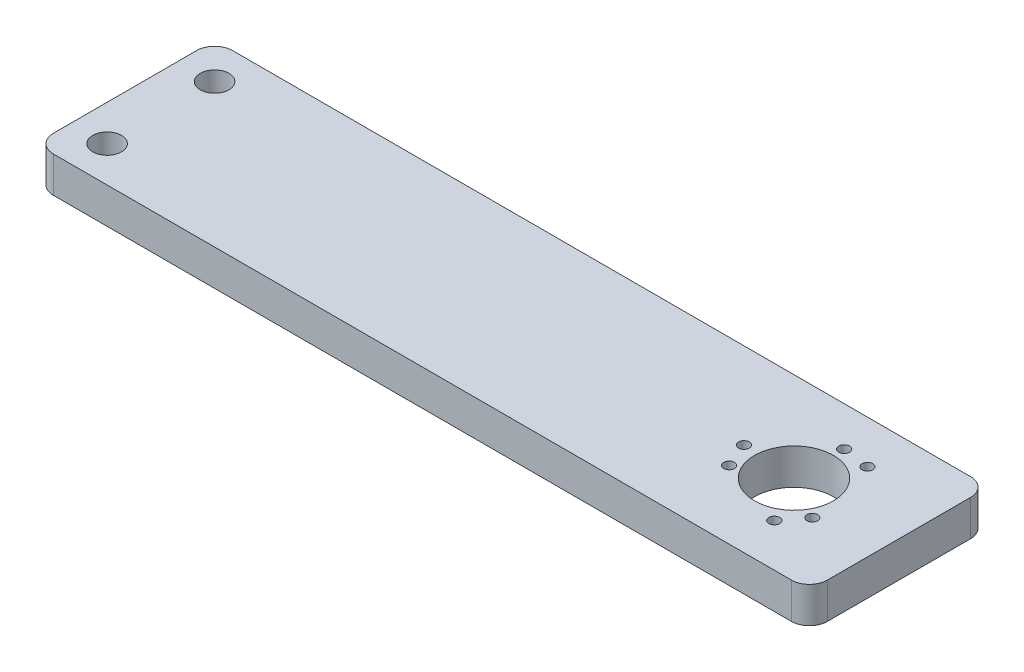
ISO-10303-21;
HEADER;
FILE_DESCRIPTION(('STEP AP214'),'2;1');
FILE_NAME('part.step','',(''),(''),'','','');
FILE_SCHEMA(('AUTOMOTIVE_DESIGN { 1 0 10303 214 1 1 1 1 }'));
ENDSEC;
DATA;
#1=APPLICATION_CONTEXT('core data for automotive mechanical design processes');
#2=APPLICATION_PROTOCOL_DEFINITION('international standard','automotive_design',2000,#1);
#3=PRODUCT_CONTEXT('',#1,'mechanical');
#4=PRODUCT('Part','Part','',(#3));
#5=PRODUCT_RELATED_PRODUCT_CATEGORY('part','',(#4));
#6=PRODUCT_DEFINITION_FORMATION('','',#4);
#7=PRODUCT_DEFINITION_CONTEXT('part definition',#1,'design');
#8=PRODUCT_DEFINITION('design','',#6,#7);
#9=PRODUCT_DEFINITION_SHAPE('','',#8);
#10=(LENGTH_UNIT() NAMED_UNIT(*) SI_UNIT(.MILLI.,.METRE.));
#11=(NAMED_UNIT(*) PLANE_ANGLE_UNIT() SI_UNIT($,.RADIAN.));
#12=(NAMED_UNIT(*) SI_UNIT($,.STERADIAN.) SOLID_ANGLE_UNIT());
#13=UNCERTAINTY_MEASURE_WITH_UNIT(LENGTH_MEASURE(1.E-05),#10,'distance_accuracy_value','');
#14=(GEOMETRIC_REPRESENTATION_CONTEXT(3) GLOBAL_UNCERTAINTY_ASSIGNED_CONTEXT((#13)) GLOBAL_UNIT_ASSIGNED_CONTEXT((#10,
#11,#12)) REPRESENTATION_CONTEXT('',''));
#15=CARTESIAN_POINT('',(0.,0.,0.));
#16=DIRECTION('',(0.,0.,1.));
#17=DIRECTION('',(1.,0.,0.));
#18=AXIS2_PLACEMENT_3D('',#15,#16,#17);
#19=CARTESIAN_POINT('',(-103.,10.,-20.));
#20=DIRECTION('',(0.,-1.,0.));
#21=DIRECTION('',(0.,0.,-1.));
#22=AXIS2_PLACEMENT_3D('',#19,#20,#21);
#23=PLANE('',#22);
#24=CARTESIAN_POINT('',(-103.,10.,-20.));
#25=DIRECTION('',(0.,-1.,0.));
#26=DIRECTION('',(0.,0.,-1.));
#27=AXIS2_PLACEMENT_3D('',#24,#25,#26);
#28=CIRCLE('',#27,5.);
#29=CARTESIAN_POINT('',(-108.,10.,-20.));
#30=VERTEX_POINT('',#29);
#31=CARTESIAN_POINT('',(-103.,10.,-25.));
#32=VERTEX_POINT('',#31);
#33=EDGE_CURVE('E411',#30,#32,#28,.T.);
#34=ORIENTED_EDGE('',*,*,#33,.F.);
#35=DIRECTION('',(0.,0.,-1.));
#36=VECTOR('',#35,1.);
#37=CARTESIAN_POINT('',(-108.,10.,20.));
#38=LINE('',#37,#36);
#39=CARTESIAN_POINT('',(-108.,10.,20.));
#40=VERTEX_POINT('',#39);
#41=EDGE_CURVE('E386',#40,#30,#38,.T.);
#42=ORIENTED_EDGE('',*,*,#41,.F.);
#43=CARTESIAN_POINT('',(-103.,10.,20.));
#44=DIRECTION('',(0.,-1.,0.));
#45=DIRECTION('',(0.,0.,-1.));
#46=AXIS2_PLACEMENT_3D('',#43,#44,#45);
#47=CIRCLE('',#46,5.);
#48=CARTESIAN_POINT('',(-103.,10.,25.));
#49=VERTEX_POINT('',#48);
#50=EDGE_CURVE('E370',#49,#40,#47,.T.);
#51=ORIENTED_EDGE('',*,*,#50,.F.);
#52=DIRECTION('',(1.,0.,0.));
#53=VECTOR('',#52,1.);
#54=CARTESIAN_POINT('',(-103.,10.,25.));
#55=LINE('',#54,#53);
#56=CARTESIAN_POINT('',(103.,10.,25.));
#57=VERTEX_POINT('',#56);
#58=EDGE_CURVE('E378',#49,#57,#55,.T.);
#59=ORIENTED_EDGE('',*,*,#58,.T.);
#60=CARTESIAN_POINT('',(103.,10.,20.));
#61=DIRECTION('',(0.,1.,0.));
#62=DIRECTION('',(0.,0.,1.));
#63=AXIS2_PLACEMENT_3D('',#60,#61,#62);
#64=CIRCLE('',#63,5.);
#65=CARTESIAN_POINT('',(108.,10.,20.));
#66=VERTEX_POINT('',#65);
#67=EDGE_CURVE('E383',#57,#66,#64,.T.);
#68=ORIENTED_EDGE('',*,*,#67,.T.);
#69=DIRECTION('',(0.,0.,-1.));
#70=VECTOR('',#69,1.);
#71=CARTESIAN_POINT('',(108.,10.,20.));
#72=LINE('',#71,#70);
#73=CARTESIAN_POINT('',(108.,10.,-20.));
#74=VERTEX_POINT('',#73);
#75=EDGE_CURVE('E542',#66,#74,#72,.T.);
#76=ORIENTED_EDGE('',*,*,#75,.T.);
#77=CARTESIAN_POINT('',(103.,10.,-20.));
#78=DIRECTION('',(0.,-1.,0.));
#79=DIRECTION('',(0.,0.,-1.));
#80=AXIS2_PLACEMENT_3D('',#77,#78,#79);
#81=CIRCLE('',#80,5.);
#82=CARTESIAN_POINT('',(103.,10.,-25.));
#83=VERTEX_POINT('',#82);
#84=EDGE_CURVE('E539',#83,#74,#81,.T.);
#85=ORIENTED_EDGE('',*,*,#84,.F.);
#86=DIRECTION('',(1.,0.,0.));
#87=VECTOR('',#86,1.);
#88=CARTESIAN_POINT('',(-103.,10.,-25.));
#89=LINE('',#88,#87);
#90=EDGE_CURVE('E537',#32,#83,#89,.T.);
#91=ORIENTED_EDGE('',*,*,#90,.F.);
#92=EDGE_LOOP('',(#34,#42,#51,#59,#68,#76,#85,#91));
#93=FACE_BOUND('',#92,.T.);
#94=CARTESIAN_POINT('',(-98.,10.,-15.));
#95=DIRECTION('',(0.,1.,0.));
#96=DIRECTION('',(0.,0.,1.));
#97=AXIS2_PLACEMENT_3D('',#94,#95,#96);
#98=CIRCLE('',#97,4.00000000000001);
#99=CARTESIAN_POINT('',(-98.,10.,-11.));
#100=VERTEX_POINT('',#99);
#101=EDGE_CURVE('E395',#100,#100,#98,.T.);
#102=ORIENTED_EDGE('',*,*,#101,.F.);
#103=EDGE_LOOP('',(#102));
#104=FACE_BOUND('',#103,.T.);
#105=CARTESIAN_POINT('',(-98.,10.,15.));
#106=DIRECTION('',(0.,1.,0.));
#107=DIRECTION('',(0.,0.,1.));
#108=AXIS2_PLACEMENT_3D('',#105,#106,#107);
#109=CIRCLE('',#108,4.00000000000001);
#110=CARTESIAN_POINT('',(-98.,10.,19.));
#111=VERTEX_POINT('',#110);
#112=EDGE_CURVE('E526',#111,#111,#109,.T.);
#113=ORIENTED_EDGE('',*,*,#112,.F.);
#114=EDGE_LOOP('',(#113));
#115=FACE_BOUND('',#114,.T.);
#116=CARTESIAN_POINT('',(78.7,10.,0.));
#117=DIRECTION('',(0.,1.,0.));
#118=DIRECTION('',(0.,0.,1.));
#119=AXIS2_PLACEMENT_3D('',#116,#117,#118);
#120=CIRCLE('',#119,11.);
#121=CARTESIAN_POINT('',(78.7,10.,11.));
#122=VERTEX_POINT('',#121);
#123=EDGE_CURVE('E520',#122,#122,#120,.T.);
#124=ORIENTED_EDGE('',*,*,#123,.F.);
#125=EDGE_LOOP('',(#124));
#126=FACE_BOUND('',#125,.T.);
#127=CARTESIAN_POINT('',(66.57564435,10.,5.99106836347522));
#128=DIRECTION('',(0.,1.,0.));
#129=DIRECTION('',(0.,0.,1.));
#130=AXIS2_PLACEMENT_3D('',#127,#128,#129);
#131=CIRCLE('',#130,1.5);
#132=CARTESIAN_POINT('',(66.57564435,10.,7.49106836347522));
#133=VERTEX_POINT('',#132);
#134=EDGE_CURVE('E514',#133,#133,#131,.T.);
#135=ORIENTED_EDGE('',*,*,#134,.F.);
#136=EDGE_LOOP('',(#135));
#137=FACE_BOUND('',#136,.T.);
#138=CARTESIAN_POINT('',(63.7,10.,-1.00893163652478));
#139=DIRECTION('',(0.,1.,0.));
#140=DIRECTION('',(0.,0.,1.));
#141=AXIS2_PLACEMENT_3D('',#138,#139,#140);
#142=CIRCLE('',#141,1.5);
#143=CARTESIAN_POINT('',(63.7,10.,0.491068363475221));
#144=VERTEX_POINT('',#143);
#145=EDGE_CURVE('E508',#144,#144,#142,.T.);
#146=ORIENTED_EDGE('',*,*,#145,.F.);
#147=EDGE_LOOP('',(#146));
#148=FACE_BOUND('',#147,.T.);
#149=CARTESIAN_POINT('',(78.7,10.,-14.));
#150=DIRECTION('',(0.,1.,0.));
#151=DIRECTION('',(0.,0.,1.));
#152=AXIS2_PLACEMENT_3D('',#149,#150,#151);
#153=CIRCLE('',#152,1.5);
#154=CARTESIAN_POINT('',(78.7,10.,-12.5));
#155=VERTEX_POINT('',#154);
#156=EDGE_CURVE('E502',#155,#155,#153,.T.);
#157=ORIENTED_EDGE('',*,*,#156,.F.);
#158=EDGE_LOOP('',(#157));
#159=FACE_BOUND('',#158,.T.);
#160=CARTESIAN_POINT('',(86.2,10.,-12.99038106));
#161=DIRECTION('',(0.,1.,0.));
#162=DIRECTION('',(0.,0.,1.));
#163=AXIS2_PLACEMENT_3D('',#160,#161,#162);
#164=CIRCLE('',#163,1.49999999999998);
#165=CARTESIAN_POINT('',(86.2,10.,-11.49038106));
#166=VERTEX_POINT('',#165);
#167=EDGE_CURVE('E496',#166,#166,#164,.T.);
#168=ORIENTED_EDGE('',*,*,#167,.F.);
#169=EDGE_LOOP('',(#168));
#170=FACE_BOUND('',#169,.T.);
#171=CARTESIAN_POINT('',(90.82435565,10.,7.00000000172179));
#172=DIRECTION('',(0.,1.,0.));
#173=DIRECTION('',(0.,0.,1.));
#174=AXIS2_PLACEMENT_3D('',#171,#172,#173);
#175=CIRCLE('',#174,1.5);
#176=CARTESIAN_POINT('',(90.82435565,10.,8.50000000172179));
#177=VERTEX_POINT('',#176);
#178=EDGE_CURVE('E490',#177,#177,#175,.T.);
#179=ORIENTED_EDGE('',*,*,#178,.F.);
#180=EDGE_LOOP('',(#179));
#181=FACE_BOUND('',#180,.T.);
#182=CARTESIAN_POINT('',(86.1999999970179,10.,12.9903810584883));
#183=DIRECTION('',(0.,1.,0.));
#184=DIRECTION('',(0.,0.,1.));
#185=AXIS2_PLACEMENT_3D('',#182,#183,#184);
#186=CIRCLE('',#185,1.5);
#187=CARTESIAN_POINT('',(86.1999999970179,10.,14.4903810584883));
#188=VERTEX_POINT('',#187);
#189=EDGE_CURVE('E481',#188,#188,#186,.T.);
#190=ORIENTED_EDGE('',*,*,#189,.F.);
#191=EDGE_LOOP('',(#190));
#192=FACE_BOUND('',#191,.T.);
#193=ADVANCED_FACE('F296',(#93,#104,#115,#126,#137,#148,#159,#170,#181,#192),#23,.F.);
#194=CARTESIAN_POINT('',(-103.,0.,-20.));
#195=DIRECTION('',(0.,-1.,0.));
#196=DIRECTION('',(0.,0.,-1.));
#197=AXIS2_PLACEMENT_3D('',#194,#195,#196);
#198=PLANE('',#197);
#199=CARTESIAN_POINT('',(90.82435565,0.,7.00000000172179));
#200=DIRECTION('',(0.,1.,0.));
#201=DIRECTION('',(0.,0.,1.));
#202=AXIS2_PLACEMENT_3D('',#199,#200,#201);
#203=CIRCLE('',#202,1.5);
#204=CARTESIAN_POINT('',(90.82435565,0.,8.50000000172179));
#205=VERTEX_POINT('',#204);
#206=EDGE_CURVE('E487',#205,#205,#203,.T.);
#207=ORIENTED_EDGE('',*,*,#206,.T.);
#208=EDGE_LOOP('',(#207));
#209=FACE_BOUND('',#208,.T.);
#210=CARTESIAN_POINT('',(78.7,0.,-14.));
#211=DIRECTION('',(0.,1.,0.));
#212=DIRECTION('',(0.,0.,1.));
#213=AXIS2_PLACEMENT_3D('',#210,#211,#212);
#214=CIRCLE('',#213,1.5);
#215=CARTESIAN_POINT('',(78.7,0.,-12.5));
#216=VERTEX_POINT('',#215);
#217=EDGE_CURVE('E499',#216,#216,#214,.T.);
#218=ORIENTED_EDGE('',*,*,#217,.T.);
#219=EDGE_LOOP('',(#218));
#220=FACE_BOUND('',#219,.T.);
#221=CARTESIAN_POINT('',(66.57564435,0.,5.99106836347522));
#222=DIRECTION('',(0.,1.,0.));
#223=DIRECTION('',(0.,0.,1.));
#224=AXIS2_PLACEMENT_3D('',#221,#222,#223);
#225=CIRCLE('',#224,1.5);
#226=CARTESIAN_POINT('',(66.57564435,0.,7.49106836347522));
#227=VERTEX_POINT('',#226);
#228=EDGE_CURVE('E511',#227,#227,#225,.T.);
#229=ORIENTED_EDGE('',*,*,#228,.T.);
#230=EDGE_LOOP('',(#229));
#231=FACE_BOUND('',#230,.T.);
#232=CARTESIAN_POINT('',(-98.,0.,15.));
#233=DIRECTION('',(0.,1.,0.));
#234=DIRECTION('',(0.,0.,1.));
#235=AXIS2_PLACEMENT_3D('',#232,#233,#234);
#236=CIRCLE('',#235,4.00000000000001);
#237=CARTESIAN_POINT('',(-98.,0.,19.));
#238=VERTEX_POINT('',#237);
#239=EDGE_CURVE('E523',#238,#238,#236,.T.);
#240=ORIENTED_EDGE('',*,*,#239,.T.);
#241=EDGE_LOOP('',(#240));
#242=FACE_BOUND('',#241,.T.);
#243=CARTESIAN_POINT('',(-103.,0.,-20.));
#244=DIRECTION('',(0.,-1.,0.));
#245=DIRECTION('',(0.,0.,-1.));
#246=AXIS2_PLACEMENT_3D('',#243,#244,#245);
#247=CIRCLE('',#246,5.);
#248=CARTESIAN_POINT('',(-108.,0.,-20.));
#249=VERTEX_POINT('',#248);
#250=CARTESIAN_POINT('',(-103.,0.,-25.));
#251=VERTEX_POINT('',#250);
#252=EDGE_CURVE('E391',#249,#251,#247,.T.);
#253=ORIENTED_EDGE('',*,*,#252,.T.);
#254=DIRECTION('',(1.,0.,0.));
#255=VECTOR('',#254,1.);
#256=CARTESIAN_POINT('',(-103.,0.,-25.));
#257=LINE('',#256,#255);
#258=CARTESIAN_POINT('',(103.,0.,-25.));
#259=VERTEX_POINT('',#258);
#260=EDGE_CURVE('E394',#251,#259,#257,.T.);
#261=ORIENTED_EDGE('',*,*,#260,.T.);
#262=CARTESIAN_POINT('',(103.,0.,-20.));
#263=DIRECTION('',(0.,-1.,0.));
#264=DIRECTION('',(0.,0.,-1.));
#265=AXIS2_PLACEMENT_3D('',#262,#263,#264);
#266=CIRCLE('',#265,5.);
#267=CARTESIAN_POINT('',(108.,0.,-20.));
#268=VERTEX_POINT('',#267);
#269=EDGE_CURVE('E398',#259,#268,#266,.T.);
#270=ORIENTED_EDGE('',*,*,#269,.T.);
#271=DIRECTION('',(0.,0.,-1.));
#272=VECTOR('',#271,1.);
#273=CARTESIAN_POINT('',(108.,0.,20.));
#274=LINE('',#273,#272);
#275=CARTESIAN_POINT('',(108.,0.,20.));
#276=VERTEX_POINT('',#275);
#277=EDGE_CURVE('E401',#276,#268,#274,.T.);
#278=ORIENTED_EDGE('',*,*,#277,.F.);
#279=CARTESIAN_POINT('',(103.,0.,20.));
#280=DIRECTION('',(0.,1.,0.));
#281=DIRECTION('',(0.,0.,1.));
#282=AXIS2_PLACEMENT_3D('',#279,#280,#281);
#283=CIRCLE('',#282,5.);
#284=CARTESIAN_POINT('',(103.,0.,25.));
#285=VERTEX_POINT('',#284);
#286=EDGE_CURVE('E404',#285,#276,#283,.T.);
#287=ORIENTED_EDGE('',*,*,#286,.F.);
#288=DIRECTION('',(1.,0.,0.));
#289=VECTOR('',#288,1.);
#290=CARTESIAN_POINT('',(-103.,0.,25.));
#291=LINE('',#290,#289);
#292=CARTESIAN_POINT('',(-103.,0.,25.));
#293=VERTEX_POINT('',#292);
#294=EDGE_CURVE('E406',#293,#285,#291,.T.);
#295=ORIENTED_EDGE('',*,*,#294,.F.);
#296=CARTESIAN_POINT('',(-103.,0.,20.));
#297=DIRECTION('',(0.,-1.,0.));
#298=DIRECTION('',(0.,0.,-1.));
#299=AXIS2_PLACEMENT_3D('',#296,#297,#298);
#300=CIRCLE('',#299,5.);
#301=CARTESIAN_POINT('',(-108.,0.,20.));
#302=VERTEX_POINT('',#301);
#303=EDGE_CURVE('E372',#293,#302,#300,.T.);
#304=ORIENTED_EDGE('',*,*,#303,.T.);
#305=DIRECTION('',(0.,0.,-1.));
#306=VECTOR('',#305,1.);
#307=CARTESIAN_POINT('',(-108.,0.,20.));
#308=LINE('',#307,#306);
#309=EDGE_CURVE('E409',#302,#249,#308,.T.);
#310=ORIENTED_EDGE('',*,*,#309,.T.);
#311=EDGE_LOOP('',(#253,#261,#270,#278,#287,#295,#304,#310));
#312=FACE_BOUND('',#311,.T.);
#313=CARTESIAN_POINT('',(-98.,0.,-15.));
#314=DIRECTION('',(0.,1.,0.));
#315=DIRECTION('',(0.,0.,1.));
#316=AXIS2_PLACEMENT_3D('',#313,#314,#315);
#317=CIRCLE('',#316,4.00000000000001);
#318=CARTESIAN_POINT('',(-98.,0.,-11.));
#319=VERTEX_POINT('',#318);
#320=EDGE_CURVE('E529',#319,#319,#317,.T.);
#321=ORIENTED_EDGE('',*,*,#320,.T.);
#322=EDGE_LOOP('',(#321));
#323=FACE_BOUND('',#322,.T.);
#324=CARTESIAN_POINT('',(78.7,0.,0.));
#325=DIRECTION('',(0.,1.,0.));
#326=DIRECTION('',(0.,0.,1.));
#327=AXIS2_PLACEMENT_3D('',#324,#325,#326);
#328=CIRCLE('',#327,11.);
#329=CARTESIAN_POINT('',(78.7,0.,11.));
#330=VERTEX_POINT('',#329);
#331=EDGE_CURVE('E517',#330,#330,#328,.T.);
#332=ORIENTED_EDGE('',*,*,#331,.T.);
#333=EDGE_LOOP('',(#332));
#334=FACE_BOUND('',#333,.T.);
#335=CARTESIAN_POINT('',(63.7,0.,-1.00893163652478));
#336=DIRECTION('',(0.,1.,0.));
#337=DIRECTION('',(0.,0.,1.));
#338=AXIS2_PLACEMENT_3D('',#335,#336,#337);
#339=CIRCLE('',#338,1.5);
#340=CARTESIAN_POINT('',(63.7,0.,0.491068363475221));
#341=VERTEX_POINT('',#340);
#342=EDGE_CURVE('E505',#341,#341,#339,.T.);
#343=ORIENTED_EDGE('',*,*,#342,.T.);
#344=EDGE_LOOP('',(#343));
#345=FACE_BOUND('',#344,.T.);
#346=CARTESIAN_POINT('',(86.2,0.,-12.99038106));
#347=DIRECTION('',(0.,1.,0.));
#348=DIRECTION('',(0.,0.,1.));
#349=AXIS2_PLACEMENT_3D('',#346,#347,#348);
#350=CIRCLE('',#349,1.49999999999998);
#351=CARTESIAN_POINT('',(86.2,0.,-11.49038106));
#352=VERTEX_POINT('',#351);
#353=EDGE_CURVE('E493',#352,#352,#350,.T.);
#354=ORIENTED_EDGE('',*,*,#353,.T.);
#355=EDGE_LOOP('',(#354));
#356=FACE_BOUND('',#355,.T.);
#357=CARTESIAN_POINT('',(86.1999999970179,0.,12.9903810584883));
#358=DIRECTION('',(0.,1.,0.));
#359=DIRECTION('',(0.,0.,1.));
#360=AXIS2_PLACEMENT_3D('',#357,#358,#359);
#361=CIRCLE('',#360,1.5);
#362=CARTESIAN_POINT('',(86.1999999970179,0.,14.4903810584883));
#363=VERTEX_POINT('',#362);
#364=EDGE_CURVE('E484',#363,#363,#361,.T.);
#365=ORIENTED_EDGE('',*,*,#364,.T.);
#366=EDGE_LOOP('',(#365));
#367=FACE_BOUND('',#366,.T.);
#368=ADVANCED_FACE('F423',(#209,#220,#231,#242,#312,#323,#334,#345,#356,#367),#198,.T.);
#369=CARTESIAN_POINT('',(-103.,10.,-20.));
#370=DIRECTION('',(0.,-1.,0.));
#371=DIRECTION('',(0.,0.,-1.));
#372=AXIS2_PLACEMENT_3D('',#369,#370,#371);
#373=CYLINDRICAL_SURFACE('',#372,5.);
#374=ORIENTED_EDGE('',*,*,#252,.F.);
#375=DIRECTION('',(0.,-1.,0.));
#376=VECTOR('',#375,1.);
#377=CARTESIAN_POINT('',(-108.,10.,-20.));
#378=LINE('',#377,#376);
#379=EDGE_CURVE('E12',#30,#249,#378,.T.);
#380=ORIENTED_EDGE('',*,*,#379,.F.);
#381=ORIENTED_EDGE('',*,*,#33,.T.);
#382=DIRECTION('',(0.,-1.,0.));
#383=VECTOR('',#382,1.);
#384=CARTESIAN_POINT('',(-103.,10.,-25.));
#385=LINE('',#384,#383);
#386=EDGE_CURVE('E300',#32,#251,#385,.T.);
#387=ORIENTED_EDGE('',*,*,#386,.T.);
#388=EDGE_LOOP('',(#374,#380,#381,#387));
#389=FACE_BOUND('',#388,.T.);
#390=ADVANCED_FACE('F298',(#389),#373,.T.);
#391=CARTESIAN_POINT('',(-108.,10.,20.));
#392=DIRECTION('',(-1.,0.,0.));
#393=DIRECTION('',(0.,0.,1.));
#394=AXIS2_PLACEMENT_3D('',#391,#392,#393);
#395=PLANE('',#394);
#396=ORIENTED_EDGE('',*,*,#309,.F.);
#397=DIRECTION('',(0.,-1.,0.));
#398=VECTOR('',#397,1.);
#399=CARTESIAN_POINT('',(-108.,10.,20.));
#400=LINE('',#399,#398);
#401=EDGE_CURVE('E306',#40,#302,#400,.T.);
#402=ORIENTED_EDGE('',*,*,#401,.F.);
#403=ORIENTED_EDGE('',*,*,#41,.T.);
#404=ORIENTED_EDGE('',*,*,#379,.T.);
#405=EDGE_LOOP('',(#396,#402,#403,#404));
#406=FACE_BOUND('',#405,.T.);
#407=ADVANCED_FACE('F425',(#406),#395,.T.);
#408=CARTESIAN_POINT('',(-103.,10.,20.));
#409=DIRECTION('',(0.,-1.,0.));
#410=DIRECTION('',(0.,0.,-1.));
#411=AXIS2_PLACEMENT_3D('',#408,#409,#410);
#412=CYLINDRICAL_SURFACE('',#411,5.);
#413=ORIENTED_EDGE('',*,*,#303,.F.);
#414=DIRECTION('',(0.,-1.,0.));
#415=VECTOR('',#414,1.);
#416=CARTESIAN_POINT('',(-103.,10.,25.));
#417=LINE('',#416,#415);
#418=EDGE_CURVE('E366',#49,#293,#417,.T.);
#419=ORIENTED_EDGE('',*,*,#418,.F.);
#420=ORIENTED_EDGE('',*,*,#50,.T.);
#421=ORIENTED_EDGE('',*,*,#401,.T.);
#422=EDGE_LOOP('',(#413,#419,#420,#421));
#423=FACE_BOUND('',#422,.T.);
#424=ADVANCED_FACE('F368',(#423),#412,.T.);
#425=CARTESIAN_POINT('',(-103.,10.,25.));
#426=DIRECTION('',(0.,0.,-1.));
#427=DIRECTION('',(-1.,0.,0.));
#428=AXIS2_PLACEMENT_3D('',#425,#426,#427);
#429=PLANE('',#428);
#430=ORIENTED_EDGE('',*,*,#294,.T.);
#431=DIRECTION('',(0.,-1.,0.));
#432=VECTOR('',#431,1.);
#433=CARTESIAN_POINT('',(103.,10.,25.));
#434=LINE('',#433,#432);
#435=EDGE_CURVE('E375',#57,#285,#434,.T.);
#436=ORIENTED_EDGE('',*,*,#435,.F.);
#437=ORIENTED_EDGE('',*,*,#58,.F.);
#438=ORIENTED_EDGE('',*,*,#418,.T.);
#439=EDGE_LOOP('',(#430,#436,#437,#438));
#440=FACE_BOUND('',#439,.T.);
#441=ADVANCED_FACE('F379',(#440),#429,.F.);
#442=CARTESIAN_POINT('',(103.,10.,20.));
#443=DIRECTION('',(0.,-1.,0.));
#444=DIRECTION('',(0.,0.,-1.));
#445=AXIS2_PLACEMENT_3D('',#442,#443,#444);
#446=CYLINDRICAL_SURFACE('',#445,5.);
#447=ORIENTED_EDGE('',*,*,#286,.T.);
#448=DIRECTION('',(0.,-1.,0.));
#449=VECTOR('',#448,1.);
#450=CARTESIAN_POINT('',(108.,10.,20.));
#451=LINE('',#450,#449);
#452=EDGE_CURVE('E415',#66,#276,#451,.T.);
#453=ORIENTED_EDGE('',*,*,#452,.F.);
#454=ORIENTED_EDGE('',*,*,#67,.F.);
#455=ORIENTED_EDGE('',*,*,#435,.T.);
#456=EDGE_LOOP('',(#447,#453,#454,#455));
#457=FACE_BOUND('',#456,.T.);
#458=ADVANCED_FACE('F548',(#457),#446,.T.);
#459=CARTESIAN_POINT('',(108.,10.,20.));
#460=DIRECTION('',(-1.,0.,0.));
#461=DIRECTION('',(0.,0.,1.));
#462=AXIS2_PLACEMENT_3D('',#459,#460,#461);
#463=PLANE('',#462);
#464=ORIENTED_EDGE('',*,*,#277,.T.);
#465=DIRECTION('',(0.,-1.,0.));
#466=VECTOR('',#465,1.);
#467=CARTESIAN_POINT('',(108.,10.,-20.));
#468=LINE('',#467,#466);
#469=EDGE_CURVE('E418',#74,#268,#468,.T.);
#470=ORIENTED_EDGE('',*,*,#469,.F.);
#471=ORIENTED_EDGE('',*,*,#75,.F.);
#472=ORIENTED_EDGE('',*,*,#452,.T.);
#473=EDGE_LOOP('',(#464,#470,#471,#472));
#474=FACE_BOUND('',#473,.T.);
#475=ADVANCED_FACE('F552',(#474),#463,.F.);
#476=CARTESIAN_POINT('',(103.,10.,-20.));
#477=DIRECTION('',(0.,-1.,0.));
#478=DIRECTION('',(0.,0.,-1.));
#479=AXIS2_PLACEMENT_3D('',#476,#477,#478);
#480=CYLINDRICAL_SURFACE('',#479,5.);
#481=ORIENTED_EDGE('',*,*,#269,.F.);
#482=DIRECTION('',(0.,-1.,0.));
#483=VECTOR('',#482,1.);
#484=CARTESIAN_POINT('',(103.,10.,-25.));
#485=LINE('',#484,#483);
#486=EDGE_CURVE('E419',#83,#259,#485,.T.);
#487=ORIENTED_EDGE('',*,*,#486,.F.);
#488=ORIENTED_EDGE('',*,*,#84,.T.);
#489=ORIENTED_EDGE('',*,*,#469,.T.);
#490=EDGE_LOOP('',(#481,#487,#488,#489));
#491=FACE_BOUND('',#490,.T.);
#492=ADVANCED_FACE('F554',(#491),#480,.T.);
#493=CARTESIAN_POINT('',(-103.,10.,-25.));
#494=DIRECTION('',(0.,0.,-1.));
#495=DIRECTION('',(-1.,0.,0.));
#496=AXIS2_PLACEMENT_3D('',#493,#494,#495);
#497=PLANE('',#496);
#498=ORIENTED_EDGE('',*,*,#260,.F.);
#499=ORIENTED_EDGE('',*,*,#386,.F.);
#500=ORIENTED_EDGE('',*,*,#90,.T.);
#501=ORIENTED_EDGE('',*,*,#486,.T.);
#502=EDGE_LOOP('',(#498,#499,#500,#501));
#503=FACE_BOUND('',#502,.T.);
#504=ADVANCED_FACE('F421',(#503),#497,.T.);
#505=CARTESIAN_POINT('',(-98.,10.,-15.));
#506=DIRECTION('',(0.,-1.,0.));
#507=DIRECTION('',(0.,0.,-1.));
#508=AXIS2_PLACEMENT_3D('',#505,#506,#507);
#509=CYLINDRICAL_SURFACE('',#508,4.00000000000001);
#510=ORIENTED_EDGE('',*,*,#101,.T.);
#511=EDGE_LOOP('',(#510));
#512=FACE_BOUND('',#511,.T.);
#513=ORIENTED_EDGE('',*,*,#320,.F.);
#514=EDGE_LOOP('',(#513));
#515=FACE_BOUND('',#514,.T.);
#516=ADVANCED_FACE('F441',(#512,#515),#509,.F.);
#517=CARTESIAN_POINT('',(-98.,10.,15.));
#518=DIRECTION('',(0.,-1.,0.));
#519=DIRECTION('',(0.,0.,-1.));
#520=AXIS2_PLACEMENT_3D('',#517,#518,#519);
#521=CYLINDRICAL_SURFACE('',#520,4.00000000000001);
#522=ORIENTED_EDGE('',*,*,#112,.T.);
#523=EDGE_LOOP('',(#522));
#524=FACE_BOUND('',#523,.T.);
#525=ORIENTED_EDGE('',*,*,#239,.F.);
#526=EDGE_LOOP('',(#525));
#527=FACE_BOUND('',#526,.T.);
#528=ADVANCED_FACE('F444',(#524,#527),#521,.F.);
#529=CARTESIAN_POINT('',(78.7,10.,0.));
#530=DIRECTION('',(0.,-1.,0.));
#531=DIRECTION('',(0.,0.,-1.));
#532=AXIS2_PLACEMENT_3D('',#529,#530,#531);
#533=CYLINDRICAL_SURFACE('',#532,11.);
#534=ORIENTED_EDGE('',*,*,#123,.T.);
#535=EDGE_LOOP('',(#534));
#536=FACE_BOUND('',#535,.T.);
#537=ORIENTED_EDGE('',*,*,#331,.F.);
#538=EDGE_LOOP('',(#537));
#539=FACE_BOUND('',#538,.T.);
#540=ADVANCED_FACE('F448',(#536,#539),#533,.F.);
#541=CARTESIAN_POINT('',(66.57564435,10.,5.99106836347522));
#542=DIRECTION('',(0.,-1.,0.));
#543=DIRECTION('',(0.,0.,-1.));
#544=AXIS2_PLACEMENT_3D('',#541,#542,#543);
#545=CYLINDRICAL_SURFACE('',#544,1.5);
#546=ORIENTED_EDGE('',*,*,#134,.T.);
#547=EDGE_LOOP('',(#546));
#548=FACE_BOUND('',#547,.T.);
#549=ORIENTED_EDGE('',*,*,#228,.F.);
#550=EDGE_LOOP('',(#549));
#551=FACE_BOUND('',#550,.T.);
#552=ADVANCED_FACE('F452',(#548,#551),#545,.F.);
#553=CARTESIAN_POINT('',(63.7,10.,-1.00893163652478));
#554=DIRECTION('',(0.,-1.,0.));
#555=DIRECTION('',(0.,0.,-1.));
#556=AXIS2_PLACEMENT_3D('',#553,#554,#555);
#557=CYLINDRICAL_SURFACE('',#556,1.5);
#558=ORIENTED_EDGE('',*,*,#145,.T.);
#559=EDGE_LOOP('',(#558));
#560=FACE_BOUND('',#559,.T.);
#561=ORIENTED_EDGE('',*,*,#342,.F.);
#562=EDGE_LOOP('',(#561));
#563=FACE_BOUND('',#562,.T.);
#564=ADVANCED_FACE('F456',(#560,#563),#557,.F.);
#565=CARTESIAN_POINT('',(78.7,10.,-14.));
#566=DIRECTION('',(0.,-1.,0.));
#567=DIRECTION('',(0.,0.,-1.));
#568=AXIS2_PLACEMENT_3D('',#565,#566,#567);
#569=CYLINDRICAL_SURFACE('',#568,1.5);
#570=ORIENTED_EDGE('',*,*,#156,.T.);
#571=EDGE_LOOP('',(#570));
#572=FACE_BOUND('',#571,.T.);
#573=ORIENTED_EDGE('',*,*,#217,.F.);
#574=EDGE_LOOP('',(#573));
#575=FACE_BOUND('',#574,.T.);
#576=ADVANCED_FACE('F460',(#572,#575),#569,.F.);
#577=CARTESIAN_POINT('',(86.2,10.,-12.99038106));
#578=DIRECTION('',(0.,-1.,0.));
#579=DIRECTION('',(0.,0.,-1.));
#580=AXIS2_PLACEMENT_3D('',#577,#578,#579);
#581=CYLINDRICAL_SURFACE('',#580,1.49999999999998);
#582=ORIENTED_EDGE('',*,*,#167,.T.);
#583=EDGE_LOOP('',(#582));
#584=FACE_BOUND('',#583,.T.);
#585=ORIENTED_EDGE('',*,*,#353,.F.);
#586=EDGE_LOOP('',(#585));
#587=FACE_BOUND('',#586,.T.);
#588=ADVANCED_FACE('F464',(#584,#587),#581,.F.);
#589=CARTESIAN_POINT('',(90.82435565,10.,7.00000000172179));
#590=DIRECTION('',(0.,-1.,0.));
#591=DIRECTION('',(0.,0.,-1.));
#592=AXIS2_PLACEMENT_3D('',#589,#590,#591);
#593=CYLINDRICAL_SURFACE('',#592,1.5);
#594=ORIENTED_EDGE('',*,*,#178,.T.);
#595=EDGE_LOOP('',(#594));
#596=FACE_BOUND('',#595,.T.);
#597=ORIENTED_EDGE('',*,*,#206,.F.);
#598=EDGE_LOOP('',(#597));
#599=FACE_BOUND('',#598,.T.);
#600=ADVANCED_FACE('F468',(#596,#599),#593,.F.);
#601=CARTESIAN_POINT('',(86.1999999970179,10.,12.9903810584883));
#602=DIRECTION('',(0.,-1.,0.));
#603=DIRECTION('',(0.,0.,-1.));
#604=AXIS2_PLACEMENT_3D('',#601,#602,#603);
#605=CYLINDRICAL_SURFACE('',#604,1.5);
#606=ORIENTED_EDGE('',*,*,#189,.T.);
#607=EDGE_LOOP('',(#606));
#608=FACE_BOUND('',#607,.T.);
#609=ORIENTED_EDGE('',*,*,#364,.F.);
#610=EDGE_LOOP('',(#609));
#611=FACE_BOUND('',#610,.T.);
#612=ADVANCED_FACE('F472',(#608,#611),#605,.F.);
#613=CLOSED_SHELL('',(#193,#368,#390,#407,#424,#441,#458,#475,#492,#504,#516,#528,#540,#552,
#564,#576,#588,#600,#612));
#614=MANIFOLD_SOLID_BREP('B2',#613);
#615=ADVANCED_BREP_SHAPE_REPRESENTATION('',(#18,#614),#14);
#616=SHAPE_DEFINITION_REPRESENTATION(#9,#615);
ENDSEC;
END-ISO-10303-21;
